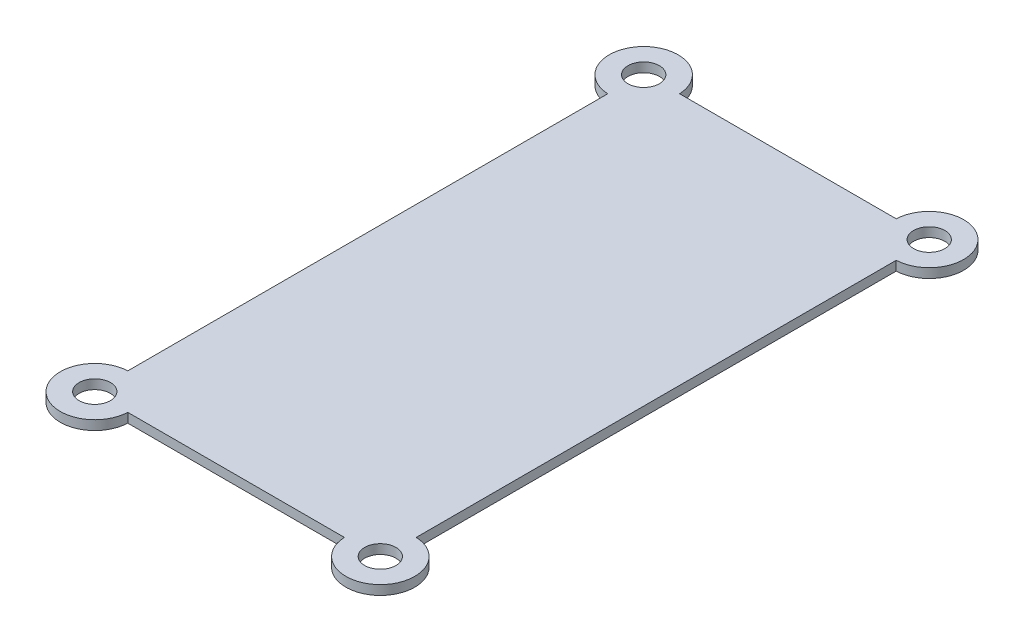
ISO-10303-21;
HEADER;
FILE_DESCRIPTION(('STEP AP214'),'2;1');
FILE_NAME('part.step','',(''),(''),'','','');
FILE_SCHEMA(('AUTOMOTIVE_DESIGN { 1 0 10303 214 1 1 1 1 }'));
ENDSEC;
DATA;
#1=APPLICATION_CONTEXT('core data for automotive mechanical design processes');
#2=APPLICATION_PROTOCOL_DEFINITION('international standard','automotive_design',2000,#1);
#3=PRODUCT_CONTEXT('',#1,'mechanical');
#4=PRODUCT('Part','Part','',(#3));
#5=PRODUCT_RELATED_PRODUCT_CATEGORY('part','',(#4));
#6=PRODUCT_DEFINITION_FORMATION('','',#4);
#7=PRODUCT_DEFINITION_CONTEXT('part definition',#1,'design');
#8=PRODUCT_DEFINITION('design','',#6,#7);
#9=PRODUCT_DEFINITION_SHAPE('','',#8);
#10=(LENGTH_UNIT() NAMED_UNIT(*) SI_UNIT(.MILLI.,.METRE.));
#11=(NAMED_UNIT(*) PLANE_ANGLE_UNIT() SI_UNIT($,.RADIAN.));
#12=(NAMED_UNIT(*) SI_UNIT($,.STERADIAN.) SOLID_ANGLE_UNIT());
#13=UNCERTAINTY_MEASURE_WITH_UNIT(LENGTH_MEASURE(1.E-05),#10,'distance_accuracy_value','');
#14=(GEOMETRIC_REPRESENTATION_CONTEXT(3) GLOBAL_UNCERTAINTY_ASSIGNED_CONTEXT((#13)) GLOBAL_UNIT_ASSIGNED_CONTEXT((#10,
#11,#12)) REPRESENTATION_CONTEXT('',''));
#15=CARTESIAN_POINT('',(0.,0.,0.));
#16=DIRECTION('',(0.,0.,1.));
#17=DIRECTION('',(1.,0.,0.));
#18=AXIS2_PLACEMENT_3D('',#15,#16,#17);
#19=CARTESIAN_POINT('',(28.9150640302673,1.905,42.8850640302673));
#20=DIRECTION('',(0.,-1.,0.));
#21=DIRECTION('',(0.,0.,-1.));
#22=AXIS2_PLACEMENT_3D('',#19,#20,#21);
#23=CYLINDRICAL_SURFACE('',#22,6.985);
#24=CARTESIAN_POINT('',(28.9150640302673,0.,42.8850640302673));
#25=DIRECTION('',(0.,1.,0.));
#26=DIRECTION('',(0.,0.,1.));
#27=AXIS2_PLACEMENT_3D('',#24,#25,#26);
#28=CIRCLE('',#27,6.985);
#29=CARTESIAN_POINT('',(21.9362935243861,0.,43.18));
#30=VERTEX_POINT('',#29);
#31=CARTESIAN_POINT('',(29.21,0.,35.9062935243861));
#32=VERTEX_POINT('',#31);
#33=EDGE_CURVE('E143',#30,#32,#28,.T.);
#34=ORIENTED_EDGE('',*,*,#33,.T.);
#35=DIRECTION('',(0.,-1.,0.));
#36=VECTOR('',#35,1.);
#37=CARTESIAN_POINT('',(29.21,1.905,35.9062935243861));
#38=LINE('',#37,#36);
#39=CARTESIAN_POINT('',(29.21,1.905,35.9062935243861));
#40=VERTEX_POINT('',#39);
#41=EDGE_CURVE('E11',#40,#32,#38,.T.);
#42=ORIENTED_EDGE('',*,*,#41,.F.);
#43=CARTESIAN_POINT('',(28.9150640302673,1.905,42.8850640302673));
#44=DIRECTION('',(0.,1.,0.));
#45=DIRECTION('',(0.,0.,1.));
#46=AXIS2_PLACEMENT_3D('',#43,#44,#45);
#47=CIRCLE('',#46,6.985);
#48=CARTESIAN_POINT('',(21.9362935243861,1.905,43.18));
#49=VERTEX_POINT('',#48);
#50=EDGE_CURVE('E173',#49,#40,#47,.T.);
#51=ORIENTED_EDGE('',*,*,#50,.F.);
#52=DIRECTION('',(0.,-1.,0.));
#53=VECTOR('',#52,1.);
#54=CARTESIAN_POINT('',(21.9362935243861,1.905,43.18));
#55=LINE('',#54,#53);
#56=EDGE_CURVE('E142',#49,#30,#55,.T.);
#57=ORIENTED_EDGE('',*,*,#56,.T.);
#58=EDGE_LOOP('',(#34,#42,#51,#57));
#59=FACE_BOUND('',#58,.T.);
#60=ADVANCED_FACE('F35',(#59),#23,.T.);
#61=CARTESIAN_POINT('',(29.21,1.905,0.));
#62=DIRECTION('',(-1.,0.,0.));
#63=DIRECTION('',(0.,0.,1.));
#64=AXIS2_PLACEMENT_3D('',#61,#62,#63);
#65=PLANE('',#64);
#66=DIRECTION('',(0.,0.,-1.));
#67=VECTOR('',#66,1.);
#68=CARTESIAN_POINT('',(29.21,0.,0.));
#69=LINE('',#68,#67);
#70=CARTESIAN_POINT('',(29.21,0.,-61.306293524386));
#71=VERTEX_POINT('',#70);
#72=EDGE_CURVE('E146',#32,#71,#69,.T.);
#73=ORIENTED_EDGE('',*,*,#72,.T.);
#74=DIRECTION('',(0.,-1.,0.));
#75=VECTOR('',#74,1.);
#76=CARTESIAN_POINT('',(29.21,1.905,-61.306293524386));
#77=LINE('',#76,#75);
#78=CARTESIAN_POINT('',(29.21,1.905,-61.306293524386));
#79=VERTEX_POINT('',#78);
#80=EDGE_CURVE('E43',#79,#71,#77,.T.);
#81=ORIENTED_EDGE('',*,*,#80,.F.);
#82=DIRECTION('',(0.,0.,-1.));
#83=VECTOR('',#82,1.);
#84=CARTESIAN_POINT('',(29.21,1.905,0.));
#85=LINE('',#84,#83);
#86=EDGE_CURVE('E90',#40,#79,#85,.T.);
#87=ORIENTED_EDGE('',*,*,#86,.F.);
#88=ORIENTED_EDGE('',*,*,#41,.T.);
#89=EDGE_LOOP('',(#73,#81,#87,#88));
#90=FACE_BOUND('',#89,.T.);
#91=ADVANCED_FACE('F204',(#90),#65,.F.);
#92=CARTESIAN_POINT('',(28.9150640302673,1.905,-68.2850640302673));
#93=DIRECTION('',(0.,-1.,0.));
#94=DIRECTION('',(0.,0.,-1.));
#95=AXIS2_PLACEMENT_3D('',#92,#93,#94);
#96=CYLINDRICAL_SURFACE('',#95,6.98499999999998);
#97=CARTESIAN_POINT('',(28.9150640302673,0.,-68.2850640302673));
#98=DIRECTION('',(0.,1.,0.));
#99=DIRECTION('',(0.,0.,1.));
#100=AXIS2_PLACEMENT_3D('',#97,#98,#99);
#101=CIRCLE('',#100,6.98499999999998);
#102=CARTESIAN_POINT('',(21.9362935243861,0.,-68.58));
#103=VERTEX_POINT('',#102);
#104=EDGE_CURVE('E148',#71,#103,#101,.T.);
#105=ORIENTED_EDGE('',*,*,#104,.T.);
#106=DIRECTION('',(0.,-1.,0.));
#107=VECTOR('',#106,1.);
#108=CARTESIAN_POINT('',(21.9362935243861,1.905,-68.58));
#109=LINE('',#108,#107);
#110=CARTESIAN_POINT('',(21.9362935243861,1.905,-68.58));
#111=VERTEX_POINT('',#110);
#112=EDGE_CURVE('E179',#111,#103,#109,.T.);
#113=ORIENTED_EDGE('',*,*,#112,.F.);
#114=CARTESIAN_POINT('',(28.9150640302673,1.905,-68.2850640302673));
#115=DIRECTION('',(0.,1.,0.));
#116=DIRECTION('',(0.,0.,1.));
#117=AXIS2_PLACEMENT_3D('',#114,#115,#116);
#118=CIRCLE('',#117,6.98499999999998);
#119=EDGE_CURVE('E186',#79,#111,#118,.T.);
#120=ORIENTED_EDGE('',*,*,#119,.F.);
#121=ORIENTED_EDGE('',*,*,#80,.T.);
#122=EDGE_LOOP('',(#105,#113,#120,#121));
#123=FACE_BOUND('',#122,.T.);
#124=ADVANCED_FACE('F184',(#123),#96,.T.);
#125=CARTESIAN_POINT('',(0.,1.905,-68.58));
#126=DIRECTION('',(0.,0.,-1.));
#127=DIRECTION('',(-1.,0.,0.));
#128=AXIS2_PLACEMENT_3D('',#125,#126,#127);
#129=PLANE('',#128);
#130=DIRECTION('',(1.,0.,0.));
#131=VECTOR('',#130,1.);
#132=CARTESIAN_POINT('',(0.,0.,-68.58));
#133=LINE('',#132,#131);
#134=CARTESIAN_POINT('',(-21.9362935243861,0.,-68.58));
#135=VERTEX_POINT('',#134);
#136=EDGE_CURVE('E151',#135,#103,#133,.T.);
#137=ORIENTED_EDGE('',*,*,#136,.F.);
#138=DIRECTION('',(0.,-1.,0.));
#139=VECTOR('',#138,1.);
#140=CARTESIAN_POINT('',(-21.9362935243861,1.905,-68.58));
#141=LINE('',#140,#139);
#142=CARTESIAN_POINT('',(-21.9362935243861,1.905,-68.58));
#143=VERTEX_POINT('',#142);
#144=EDGE_CURVE('E177',#143,#135,#141,.T.);
#145=ORIENTED_EDGE('',*,*,#144,.F.);
#146=DIRECTION('',(1.,0.,0.));
#147=VECTOR('',#146,1.);
#148=CARTESIAN_POINT('',(0.,1.905,-68.58));
#149=LINE('',#148,#147);
#150=EDGE_CURVE('E196',#143,#111,#149,.T.);
#151=ORIENTED_EDGE('',*,*,#150,.T.);
#152=ORIENTED_EDGE('',*,*,#112,.T.);
#153=EDGE_LOOP('',(#137,#145,#151,#152));
#154=FACE_BOUND('',#153,.T.);
#155=ADVANCED_FACE('F194',(#154),#129,.T.);
#156=CARTESIAN_POINT('',(-28.9150640302673,1.905,-68.2850640302673));
#157=DIRECTION('',(0.,-1.,0.));
#158=DIRECTION('',(0.,0.,-1.));
#159=AXIS2_PLACEMENT_3D('',#156,#157,#158);
#160=CYLINDRICAL_SURFACE('',#159,6.985);
#161=CARTESIAN_POINT('',(-28.9150640302673,0.,-68.2850640302673));
#162=DIRECTION('',(0.,1.,0.));
#163=DIRECTION('',(0.,0.,1.));
#164=AXIS2_PLACEMENT_3D('',#161,#162,#163);
#165=CIRCLE('',#164,6.985);
#166=CARTESIAN_POINT('',(-29.21,0.,-61.306293524386));
#167=VERTEX_POINT('',#166);
#168=EDGE_CURVE('E154',#167,#135,#165,.F.);
#169=ORIENTED_EDGE('',*,*,#168,.F.);
#170=DIRECTION('',(0.,-1.,0.));
#171=VECTOR('',#170,1.);
#172=CARTESIAN_POINT('',(-29.21,1.905,-61.306293524386));
#173=LINE('',#172,#171);
#174=CARTESIAN_POINT('',(-29.21,1.905,-61.306293524386));
#175=VERTEX_POINT('',#174);
#176=EDGE_CURVE('E123',#175,#167,#173,.T.);
#177=ORIENTED_EDGE('',*,*,#176,.F.);
#178=CARTESIAN_POINT('',(-28.9150640302673,1.905,-68.2850640302673));
#179=DIRECTION('',(0.,1.,0.));
#180=DIRECTION('',(0.,0.,1.));
#181=AXIS2_PLACEMENT_3D('',#178,#179,#180);
#182=CIRCLE('',#181,6.985);
#183=EDGE_CURVE('E112',#175,#143,#182,.F.);
#184=ORIENTED_EDGE('',*,*,#183,.T.);
#185=ORIENTED_EDGE('',*,*,#144,.T.);
#186=EDGE_LOOP('',(#169,#177,#184,#185));
#187=FACE_BOUND('',#186,.T.);
#188=ADVANCED_FACE('F214',(#187),#160,.T.);
#189=CARTESIAN_POINT('',(-29.21,1.905,0.));
#190=DIRECTION('',(1.,0.,0.));
#191=DIRECTION('',(0.,0.,-1.));
#192=AXIS2_PLACEMENT_3D('',#189,#190,#191);
#193=PLANE('',#192);
#194=DIRECTION('',(0.,0.,1.));
#195=VECTOR('',#194,1.);
#196=CARTESIAN_POINT('',(-29.21,0.,0.));
#197=LINE('',#196,#195);
#198=CARTESIAN_POINT('',(-29.21,0.,35.9062935243861));
#199=VERTEX_POINT('',#198);
#200=EDGE_CURVE('E119',#167,#199,#197,.T.);
#201=ORIENTED_EDGE('',*,*,#200,.T.);
#202=DIRECTION('',(0.,-1.,0.));
#203=VECTOR('',#202,1.);
#204=CARTESIAN_POINT('',(-29.21,1.905,35.9062935243861));
#205=LINE('',#204,#203);
#206=CARTESIAN_POINT('',(-29.21,1.905,35.9062935243861));
#207=VERTEX_POINT('',#206);
#208=EDGE_CURVE('E116',#207,#199,#205,.T.);
#209=ORIENTED_EDGE('',*,*,#208,.F.);
#210=DIRECTION('',(0.,0.,1.));
#211=VECTOR('',#210,1.);
#212=CARTESIAN_POINT('',(-29.21,1.905,0.));
#213=LINE('',#212,#211);
#214=EDGE_CURVE('E104',#175,#207,#213,.T.);
#215=ORIENTED_EDGE('',*,*,#214,.F.);
#216=ORIENTED_EDGE('',*,*,#176,.T.);
#217=EDGE_LOOP('',(#201,#209,#215,#216));
#218=FACE_BOUND('',#217,.T.);
#219=ADVANCED_FACE('F117',(#218),#193,.F.);
#220=CARTESIAN_POINT('',(-28.9150640302673,1.905,42.8850640302673));
#221=DIRECTION('',(0.,-1.,0.));
#222=DIRECTION('',(0.,0.,-1.));
#223=AXIS2_PLACEMENT_3D('',#220,#221,#222);
#224=CYLINDRICAL_SURFACE('',#223,6.985);
#225=CARTESIAN_POINT('',(-28.9150640302673,0.,42.8850640302673));
#226=DIRECTION('',(0.,1.,0.));
#227=DIRECTION('',(0.,0.,1.));
#228=AXIS2_PLACEMENT_3D('',#225,#226,#227);
#229=CIRCLE('',#228,6.985);
#230=CARTESIAN_POINT('',(-21.9362935243861,0.,43.18));
#231=VERTEX_POINT('',#230);
#232=EDGE_CURVE('E158',#231,#199,#229,.F.);
#233=ORIENTED_EDGE('',*,*,#232,.F.);
#234=DIRECTION('',(0.,-1.,0.));
#235=VECTOR('',#234,1.);
#236=CARTESIAN_POINT('',(-21.9362935243861,1.905,43.18));
#237=LINE('',#236,#235);
#238=CARTESIAN_POINT('',(-21.9362935243861,1.905,43.18));
#239=VERTEX_POINT('',#238);
#240=EDGE_CURVE('E79',#239,#231,#237,.T.);
#241=ORIENTED_EDGE('',*,*,#240,.F.);
#242=CARTESIAN_POINT('',(-28.9150640302673,1.905,42.8850640302673));
#243=DIRECTION('',(0.,1.,0.));
#244=DIRECTION('',(0.,0.,1.));
#245=AXIS2_PLACEMENT_3D('',#242,#243,#244);
#246=CIRCLE('',#245,6.985);
#247=EDGE_CURVE('E109',#239,#207,#246,.F.);
#248=ORIENTED_EDGE('',*,*,#247,.T.);
#249=ORIENTED_EDGE('',*,*,#208,.T.);
#250=EDGE_LOOP('',(#233,#241,#248,#249));
#251=FACE_BOUND('',#250,.T.);
#252=ADVANCED_FACE('F125',(#251),#224,.T.);
#253=CARTESIAN_POINT('',(28.9150640302673,1.905,-68.2850640302673));
#254=DIRECTION('',(0.,-1.,0.));
#255=DIRECTION('',(0.,0.,-1.));
#256=AXIS2_PLACEMENT_3D('',#253,#254,#255);
#257=CYLINDRICAL_SURFACE('',#256,3.175);
#258=CARTESIAN_POINT('',(28.9150640302673,1.905,-68.2850640302673));
#259=DIRECTION('',(0.,1.,0.));
#260=DIRECTION('',(0.,0.,1.));
#261=AXIS2_PLACEMENT_3D('',#258,#259,#260);
#262=CIRCLE('',#261,3.175);
#263=CARTESIAN_POINT('',(28.9150640302673,1.905,-71.4600640302673));
#264=VERTEX_POINT('',#263);
#265=EDGE_CURVE('E136',#264,#264,#262,.T.);
#266=CARTESIAN_POINT('',(28.9150640302673,0.,-68.2850640302673));
#267=DIRECTION('',(0.,1.,0.));
#268=DIRECTION('',(0.,0.,1.));
#269=AXIS2_PLACEMENT_3D('',#266,#267,#268);
#270=CIRCLE('',#269,3.175);
#271=CARTESIAN_POINT('',(28.9150640302673,0.,-71.4600640302673));
#272=VERTEX_POINT('',#271);
#273=EDGE_CURVE('E167',#272,#272,#270,.T.);
#274=CARTESIAN_POINT('',(28.9150640302673,1.905,-71.4600640302673));
#275=CARTESIAN_POINT('',(28.9150640302673,1.88515625,-71.4600640302673));
#276=CARTESIAN_POINT('',(28.9150640302673,1.8653125,-71.4600640302673));
#277=CARTESIAN_POINT('',(28.9150640302673,1.825625,-71.4600640302673));
#278=CARTESIAN_POINT('',(28.9150640302673,1.80578125,-71.4600640302673));
#279=CARTESIAN_POINT('',(28.9150640302673,1.76609375,-71.4600640302673));
#280=CARTESIAN_POINT('',(28.9150640302673,1.74625,-71.4600640302673));
#281=CARTESIAN_POINT('',(28.9150640302673,1.7065625,-71.4600640302673));
#282=CARTESIAN_POINT('',(28.9150640302673,1.68671875,-71.4600640302673));
#283=CARTESIAN_POINT('',(28.9150640302673,1.64703125,-71.4600640302673));
#284=CARTESIAN_POINT('',(28.9150640302673,1.6271875,-71.4600640302673));
#285=CARTESIAN_POINT('',(28.9150640302673,1.5875,-71.4600640302673));
#286=CARTESIAN_POINT('',(28.9150640302673,1.56765625,-71.4600640302673));
#287=CARTESIAN_POINT('',(28.9150640302673,1.52796875,-71.4600640302673));
#288=CARTESIAN_POINT('',(28.9150640302673,1.508125,-71.4600640302673));
#289=CARTESIAN_POINT('',(28.9150640302673,1.4684375,-71.4600640302673));
#290=CARTESIAN_POINT('',(28.9150640302673,1.44859375,-71.4600640302673));
#291=CARTESIAN_POINT('',(28.9150640302673,1.40890625,-71.4600640302673));
#292=CARTESIAN_POINT('',(28.9150640302673,1.3890625,-71.4600640302673));
#293=CARTESIAN_POINT('',(28.9150640302673,1.349375,-71.4600640302673));
#294=CARTESIAN_POINT('',(28.9150640302673,1.32953125,-71.4600640302673));
#295=CARTESIAN_POINT('',(28.9150640302673,1.28984375,-71.4600640302673));
#296=CARTESIAN_POINT('',(28.9150640302673,1.27,-71.4600640302673));
#297=CARTESIAN_POINT('',(28.9150640302673,1.2303125,-71.4600640302673));
#298=CARTESIAN_POINT('',(28.9150640302673,1.21046875,-71.4600640302673));
#299=CARTESIAN_POINT('',(28.9150640302673,1.17078125,-71.4600640302673));
#300=CARTESIAN_POINT('',(28.9150640302673,1.1509375,-71.4600640302673));
#301=CARTESIAN_POINT('',(28.9150640302673,1.11125,-71.4600640302673));
#302=CARTESIAN_POINT('',(28.9150640302673,1.09140625,-71.4600640302673));
#303=CARTESIAN_POINT('',(28.9150640302673,1.05171875,-71.4600640302673));
#304=CARTESIAN_POINT('',(28.9150640302673,1.031875,-71.4600640302673));
#305=CARTESIAN_POINT('',(28.9150640302673,0.9921875,-71.4600640302673));
#306=CARTESIAN_POINT('',(28.9150640302673,0.97234375,-71.4600640302673));
#307=CARTESIAN_POINT('',(28.9150640302673,0.93265625,-71.4600640302673));
#308=CARTESIAN_POINT('',(28.9150640302673,0.9128125,-71.4600640302673));
#309=CARTESIAN_POINT('',(28.9150640302673,0.873125,-71.4600640302673));
#310=CARTESIAN_POINT('',(28.9150640302673,0.85328125,-71.4600640302673));
#311=CARTESIAN_POINT('',(28.9150640302673,0.81359375,-71.4600640302673));
#312=CARTESIAN_POINT('',(28.9150640302673,0.79375,-71.4600640302673));
#313=CARTESIAN_POINT('',(28.9150640302673,0.7540625,-71.4600640302673));
#314=CARTESIAN_POINT('',(28.9150640302673,0.73421875,-71.4600640302673));
#315=CARTESIAN_POINT('',(28.9150640302673,0.69453125,-71.4600640302673));
#316=CARTESIAN_POINT('',(28.9150640302673,0.6746875,-71.4600640302673));
#317=CARTESIAN_POINT('',(28.9150640302673,0.635,-71.4600640302673));
#318=CARTESIAN_POINT('',(28.9150640302673,0.61515625,-71.4600640302673));
#319=CARTESIAN_POINT('',(28.9150640302673,0.57546875,-71.4600640302673));
#320=CARTESIAN_POINT('',(28.9150640302673,0.555625,-71.4600640302673));
#321=CARTESIAN_POINT('',(28.9150640302673,0.5159375,-71.4600640302673));
#322=CARTESIAN_POINT('',(28.9150640302673,0.49609375,-71.4600640302673));
#323=CARTESIAN_POINT('',(28.9150640302673,0.45640625,-71.4600640302673));
#324=CARTESIAN_POINT('',(28.9150640302673,0.4365625,-71.4600640302673));
#325=CARTESIAN_POINT('',(28.9150640302673,0.396875,-71.4600640302673));
#326=CARTESIAN_POINT('',(28.9150640302673,0.37703125,-71.4600640302673));
#327=CARTESIAN_POINT('',(28.9150640302673,0.33734375,-71.4600640302673));
#328=CARTESIAN_POINT('',(28.9150640302673,0.3175,-71.4600640302673));
#329=CARTESIAN_POINT('',(28.9150640302673,0.2778125,-71.4600640302673));
#330=CARTESIAN_POINT('',(28.9150640302673,0.25796875,-71.4600640302673));
#331=CARTESIAN_POINT('',(28.9150640302673,0.21828125,-71.4600640302673));
#332=CARTESIAN_POINT('',(28.9150640302673,0.1984375,-71.4600640302673));
#333=CARTESIAN_POINT('',(28.9150640302673,0.15875,-71.4600640302673));
#334=CARTESIAN_POINT('',(28.9150640302673,0.13890625,-71.4600640302673));
#335=CARTESIAN_POINT('',(28.9150640302673,0.09921875,-71.4600640302673));
#336=CARTESIAN_POINT('',(28.9150640302673,0.0793749999999999,-71.4600640302673));
#337=CARTESIAN_POINT('',(28.9150640302673,0.0396874999999999,-71.4600640302673));
#338=CARTESIAN_POINT('',(28.9150640302673,0.01984375,-71.4600640302673));
#339=CARTESIAN_POINT('',(28.9150640302673,0.,-71.4600640302673));
#340=B_SPLINE_CURVE_WITH_KNOTS('',3,(#274,#275,#276,#277,#278,#279,#280,#281,#282,#283,#284,
#285,#286,#287,#288,#289,#290,#291,#292,#293,#294,#295,#296,#297,#298,#299,#300,#301,#302,#303,
#304,#305,#306,#307,#308,#309,#310,#311,#312,#313,#314,#315,#316,#317,#318,#319,#320,#321,#322,
#323,#324,#325,#326,#327,#328,#329,#330,#331,#332,#333,#334,#335,#336,#337,#338,#339),
.UNSPECIFIED.,.F.,.F.,(4,2,2,2,2,2,2,2,2,2,2,2,2,2,2,2,2,2,2,2,2,2,2,2,2,2,2,2,2,2,2,2,4),(0.,
0.0595312500000001,0.1190625,0.17859375,0.238125,0.29765625,0.3571875,0.41671875,0.47625,
0.53578125,0.5953125,0.65484375,0.714375,0.77390625,0.8334375,0.89296875,0.9525,1.01203125,
1.0715625,1.13109375,1.190625,1.25015625,1.3096875,1.36921875,1.42875,1.48828125,1.5478125,
1.60734375,1.666875,1.72640625,1.7859375,1.84546875,1.905),.UNSPECIFIED.);
#341=EDGE_CURVE('BSEAM222',#264,#272,#340,.T.);
#342=ORIENTED_EDGE('',*,*,#265,.T.);
#343=ORIENTED_EDGE('',*,*,#273,.F.);
#344=ORIENTED_EDGE('',*,*,#341,.T.);
#345=ORIENTED_EDGE('',*,*,#341,.F.);
#346=EDGE_LOOP('',(#342,#344,#343,#345));
#347=FACE_BOUND('',#346,.T.);
#348=ADVANCED_FACE('F222',(#347),#257,.F.);
#349=CARTESIAN_POINT('',(28.9150640302673,1.905,42.8850640302673));
#350=DIRECTION('',(0.,-1.,0.));
#351=DIRECTION('',(0.,0.,-1.));
#352=AXIS2_PLACEMENT_3D('',#349,#350,#351);
#353=CYLINDRICAL_SURFACE('',#352,3.175);
#354=CARTESIAN_POINT('',(28.9150640302673,1.905,42.8850640302673));
#355=DIRECTION('',(0.,1.,0.));
#356=DIRECTION('',(0.,0.,1.));
#357=AXIS2_PLACEMENT_3D('',#354,#355,#356);
#358=CIRCLE('',#357,3.175);
#359=CARTESIAN_POINT('',(28.9150640302673,1.905,39.7100640302673));
#360=VERTEX_POINT('',#359);
#361=EDGE_CURVE('E133',#360,#360,#358,.T.);
#362=CARTESIAN_POINT('',(28.9150640302673,0.,42.8850640302673));
#363=DIRECTION('',(0.,1.,0.));
#364=DIRECTION('',(0.,0.,1.));
#365=AXIS2_PLACEMENT_3D('',#362,#363,#364);
#366=CIRCLE('',#365,3.175);
#367=CARTESIAN_POINT('',(28.9150640302673,0.,39.7100640302673));
#368=VERTEX_POINT('',#367);
#369=EDGE_CURVE('E164',#368,#368,#366,.T.);
#370=CARTESIAN_POINT('',(28.9150640302673,1.905,39.7100640302673));
#371=CARTESIAN_POINT('',(28.9150640302673,1.88515625,39.7100640302673));
#372=CARTESIAN_POINT('',(28.9150640302673,1.8653125,39.7100640302673));
#373=CARTESIAN_POINT('',(28.9150640302673,1.825625,39.7100640302673));
#374=CARTESIAN_POINT('',(28.9150640302673,1.80578125,39.7100640302673));
#375=CARTESIAN_POINT('',(28.9150640302673,1.76609375,39.7100640302673));
#376=CARTESIAN_POINT('',(28.9150640302673,1.74625,39.7100640302673));
#377=CARTESIAN_POINT('',(28.9150640302673,1.7065625,39.7100640302673));
#378=CARTESIAN_POINT('',(28.9150640302673,1.68671875,39.7100640302673));
#379=CARTESIAN_POINT('',(28.9150640302673,1.64703125,39.7100640302673));
#380=CARTESIAN_POINT('',(28.9150640302673,1.6271875,39.7100640302673));
#381=CARTESIAN_POINT('',(28.9150640302673,1.5875,39.7100640302673));
#382=CARTESIAN_POINT('',(28.9150640302673,1.56765625,39.7100640302673));
#383=CARTESIAN_POINT('',(28.9150640302673,1.52796875,39.7100640302673));
#384=CARTESIAN_POINT('',(28.9150640302673,1.508125,39.7100640302673));
#385=CARTESIAN_POINT('',(28.9150640302673,1.4684375,39.7100640302673));
#386=CARTESIAN_POINT('',(28.9150640302673,1.44859375,39.7100640302673));
#387=CARTESIAN_POINT('',(28.9150640302673,1.40890625,39.7100640302673));
#388=CARTESIAN_POINT('',(28.9150640302673,1.3890625,39.7100640302673));
#389=CARTESIAN_POINT('',(28.9150640302673,1.349375,39.7100640302673));
#390=CARTESIAN_POINT('',(28.9150640302673,1.32953125,39.7100640302673));
#391=CARTESIAN_POINT('',(28.9150640302673,1.28984375,39.7100640302673));
#392=CARTESIAN_POINT('',(28.9150640302673,1.27,39.7100640302673));
#393=CARTESIAN_POINT('',(28.9150640302673,1.2303125,39.7100640302673));
#394=CARTESIAN_POINT('',(28.9150640302673,1.21046875,39.7100640302673));
#395=CARTESIAN_POINT('',(28.9150640302673,1.17078125,39.7100640302673));
#396=CARTESIAN_POINT('',(28.9150640302673,1.1509375,39.7100640302673));
#397=CARTESIAN_POINT('',(28.9150640302673,1.11125,39.7100640302673));
#398=CARTESIAN_POINT('',(28.9150640302673,1.09140625,39.7100640302673));
#399=CARTESIAN_POINT('',(28.9150640302673,1.05171875,39.7100640302673));
#400=CARTESIAN_POINT('',(28.9150640302673,1.031875,39.7100640302673));
#401=CARTESIAN_POINT('',(28.9150640302673,0.9921875,39.7100640302673));
#402=CARTESIAN_POINT('',(28.9150640302673,0.97234375,39.7100640302673));
#403=CARTESIAN_POINT('',(28.9150640302673,0.93265625,39.7100640302673));
#404=CARTESIAN_POINT('',(28.9150640302673,0.9128125,39.7100640302673));
#405=CARTESIAN_POINT('',(28.9150640302673,0.873125,39.7100640302673));
#406=CARTESIAN_POINT('',(28.9150640302673,0.85328125,39.7100640302673));
#407=CARTESIAN_POINT('',(28.9150640302673,0.81359375,39.7100640302673));
#408=CARTESIAN_POINT('',(28.9150640302673,0.79375,39.7100640302673));
#409=CARTESIAN_POINT('',(28.9150640302673,0.7540625,39.7100640302673));
#410=CARTESIAN_POINT('',(28.9150640302673,0.73421875,39.7100640302673));
#411=CARTESIAN_POINT('',(28.9150640302673,0.69453125,39.7100640302673));
#412=CARTESIAN_POINT('',(28.9150640302673,0.6746875,39.7100640302673));
#413=CARTESIAN_POINT('',(28.9150640302673,0.635,39.7100640302673));
#414=CARTESIAN_POINT('',(28.9150640302673,0.61515625,39.7100640302673));
#415=CARTESIAN_POINT('',(28.9150640302673,0.57546875,39.7100640302673));
#416=CARTESIAN_POINT('',(28.9150640302673,0.555625,39.7100640302673));
#417=CARTESIAN_POINT('',(28.9150640302673,0.5159375,39.7100640302673));
#418=CARTESIAN_POINT('',(28.9150640302673,0.49609375,39.7100640302673));
#419=CARTESIAN_POINT('',(28.9150640302673,0.45640625,39.7100640302673));
#420=CARTESIAN_POINT('',(28.9150640302673,0.4365625,39.7100640302673));
#421=CARTESIAN_POINT('',(28.9150640302673,0.396875,39.7100640302673));
#422=CARTESIAN_POINT('',(28.9150640302673,0.37703125,39.7100640302673));
#423=CARTESIAN_POINT('',(28.9150640302673,0.33734375,39.7100640302673));
#424=CARTESIAN_POINT('',(28.9150640302673,0.3175,39.7100640302673));
#425=CARTESIAN_POINT('',(28.9150640302673,0.2778125,39.7100640302673));
#426=CARTESIAN_POINT('',(28.9150640302673,0.25796875,39.7100640302673));
#427=CARTESIAN_POINT('',(28.9150640302673,0.21828125,39.7100640302673));
#428=CARTESIAN_POINT('',(28.9150640302673,0.1984375,39.7100640302673));
#429=CARTESIAN_POINT('',(28.9150640302673,0.15875,39.7100640302673));
#430=CARTESIAN_POINT('',(28.9150640302673,0.13890625,39.7100640302673));
#431=CARTESIAN_POINT('',(28.9150640302673,0.09921875,39.7100640302673));
#432=CARTESIAN_POINT('',(28.9150640302673,0.0793749999999999,39.7100640302673));
#433=CARTESIAN_POINT('',(28.9150640302673,0.0396874999999999,39.7100640302673));
#434=CARTESIAN_POINT('',(28.9150640302673,0.01984375,39.7100640302673));
#435=CARTESIAN_POINT('',(28.9150640302673,0.,39.7100640302673));
#436=B_SPLINE_CURVE_WITH_KNOTS('',3,(#370,#371,#372,#373,#374,#375,#376,#377,#378,#379,#380,
#381,#382,#383,#384,#385,#386,#387,#388,#389,#390,#391,#392,#393,#394,#395,#396,#397,#398,#399,
#400,#401,#402,#403,#404,#405,#406,#407,#408,#409,#410,#411,#412,#413,#414,#415,#416,#417,#418,
#419,#420,#421,#422,#423,#424,#425,#426,#427,#428,#429,#430,#431,#432,#433,#434,#435),
.UNSPECIFIED.,.F.,.F.,(4,2,2,2,2,2,2,2,2,2,2,2,2,2,2,2,2,2,2,2,2,2,2,2,2,2,2,2,2,2,2,2,4),(0.,
0.0595312500000001,0.1190625,0.17859375,0.238125,0.29765625,0.3571875,0.41671875,0.47625,
0.53578125,0.5953125,0.65484375,0.714375,0.77390625,0.8334375,0.89296875,0.9525,1.01203125,
1.0715625,1.13109375,1.190625,1.25015625,1.3096875,1.36921875,1.42875,1.48828125,1.5478125,
1.60734375,1.666875,1.72640625,1.7859375,1.84546875,1.905),.UNSPECIFIED.);
#437=EDGE_CURVE('BSEAM230',#360,#368,#436,.T.);
#438=ORIENTED_EDGE('',*,*,#361,.T.);
#439=ORIENTED_EDGE('',*,*,#369,.F.);
#440=ORIENTED_EDGE('',*,*,#437,.T.);
#441=ORIENTED_EDGE('',*,*,#437,.F.);
#442=EDGE_LOOP('',(#438,#440,#439,#441));
#443=FACE_BOUND('',#442,.T.);
#444=ADVANCED_FACE('F230',(#443),#353,.F.);
#445=CARTESIAN_POINT('',(-28.9150640302673,1.905,42.8850640302673));
#446=DIRECTION('',(0.,-1.,0.));
#447=DIRECTION('',(0.,0.,-1.));
#448=AXIS2_PLACEMENT_3D('',#445,#446,#447);
#449=CYLINDRICAL_SURFACE('',#448,3.175);
#450=CARTESIAN_POINT('',(-28.9150640302673,1.905,42.8850640302673));
#451=DIRECTION('',(0.,1.,0.));
#452=DIRECTION('',(0.,0.,1.));
#453=AXIS2_PLACEMENT_3D('',#450,#451,#452);
#454=CIRCLE('',#453,3.175);
#455=CARTESIAN_POINT('',(-28.9150640302673,1.905,39.7100640302673));
#456=VERTEX_POINT('',#455);
#457=EDGE_CURVE('E127',#456,#456,#454,.F.);
#458=CARTESIAN_POINT('',(-28.9150640302673,0.,42.8850640302673));
#459=DIRECTION('',(0.,1.,0.));
#460=DIRECTION('',(0.,0.,1.));
#461=AXIS2_PLACEMENT_3D('',#458,#459,#460);
#462=CIRCLE('',#461,3.175);
#463=CARTESIAN_POINT('',(-28.9150640302673,0.,39.7100640302673));
#464=VERTEX_POINT('',#463);
#465=EDGE_CURVE('E161',#464,#464,#462,.F.);
#466=CARTESIAN_POINT('',(-28.9150640302673,1.905,39.7100640302673));
#467=CARTESIAN_POINT('',(-28.9150640302673,1.88515625,39.7100640302673));
#468=CARTESIAN_POINT('',(-28.9150640302673,1.8653125,39.7100640302673));
#469=CARTESIAN_POINT('',(-28.9150640302673,1.825625,39.7100640302673));
#470=CARTESIAN_POINT('',(-28.9150640302673,1.80578125,39.7100640302673));
#471=CARTESIAN_POINT('',(-28.9150640302673,1.76609375,39.7100640302673));
#472=CARTESIAN_POINT('',(-28.9150640302673,1.74625,39.7100640302673));
#473=CARTESIAN_POINT('',(-28.9150640302673,1.7065625,39.7100640302673));
#474=CARTESIAN_POINT('',(-28.9150640302673,1.68671875,39.7100640302673));
#475=CARTESIAN_POINT('',(-28.9150640302673,1.64703125,39.7100640302673));
#476=CARTESIAN_POINT('',(-28.9150640302673,1.6271875,39.7100640302673));
#477=CARTESIAN_POINT('',(-28.9150640302673,1.5875,39.7100640302673));
#478=CARTESIAN_POINT('',(-28.9150640302673,1.56765625,39.7100640302673));
#479=CARTESIAN_POINT('',(-28.9150640302673,1.52796875,39.7100640302673));
#480=CARTESIAN_POINT('',(-28.9150640302673,1.508125,39.7100640302673));
#481=CARTESIAN_POINT('',(-28.9150640302673,1.4684375,39.7100640302673));
#482=CARTESIAN_POINT('',(-28.9150640302673,1.44859375,39.7100640302673));
#483=CARTESIAN_POINT('',(-28.9150640302673,1.40890625,39.7100640302673));
#484=CARTESIAN_POINT('',(-28.9150640302673,1.3890625,39.7100640302673));
#485=CARTESIAN_POINT('',(-28.9150640302673,1.349375,39.7100640302673));
#486=CARTESIAN_POINT('',(-28.9150640302673,1.32953125,39.7100640302673));
#487=CARTESIAN_POINT('',(-28.9150640302673,1.28984375,39.7100640302673));
#488=CARTESIAN_POINT('',(-28.9150640302673,1.27,39.7100640302673));
#489=CARTESIAN_POINT('',(-28.9150640302673,1.2303125,39.7100640302673));
#490=CARTESIAN_POINT('',(-28.9150640302673,1.21046875,39.7100640302673));
#491=CARTESIAN_POINT('',(-28.9150640302673,1.17078125,39.7100640302673));
#492=CARTESIAN_POINT('',(-28.9150640302673,1.1509375,39.7100640302673));
#493=CARTESIAN_POINT('',(-28.9150640302673,1.11125,39.7100640302673));
#494=CARTESIAN_POINT('',(-28.9150640302673,1.09140625,39.7100640302673));
#495=CARTESIAN_POINT('',(-28.9150640302673,1.05171875,39.7100640302673));
#496=CARTESIAN_POINT('',(-28.9150640302673,1.031875,39.7100640302673));
#497=CARTESIAN_POINT('',(-28.9150640302673,0.9921875,39.7100640302673));
#498=CARTESIAN_POINT('',(-28.9150640302673,0.97234375,39.7100640302673));
#499=CARTESIAN_POINT('',(-28.9150640302673,0.93265625,39.7100640302673));
#500=CARTESIAN_POINT('',(-28.9150640302673,0.9128125,39.7100640302673));
#501=CARTESIAN_POINT('',(-28.9150640302673,0.873125,39.7100640302673));
#502=CARTESIAN_POINT('',(-28.9150640302673,0.85328125,39.7100640302673));
#503=CARTESIAN_POINT('',(-28.9150640302673,0.81359375,39.7100640302673));
#504=CARTESIAN_POINT('',(-28.9150640302673,0.79375,39.7100640302673));
#505=CARTESIAN_POINT('',(-28.9150640302673,0.7540625,39.7100640302673));
#506=CARTESIAN_POINT('',(-28.9150640302673,0.73421875,39.7100640302673));
#507=CARTESIAN_POINT('',(-28.9150640302673,0.69453125,39.7100640302673));
#508=CARTESIAN_POINT('',(-28.9150640302673,0.6746875,39.7100640302673));
#509=CARTESIAN_POINT('',(-28.9150640302673,0.635,39.7100640302673));
#510=CARTESIAN_POINT('',(-28.9150640302673,0.61515625,39.7100640302673));
#511=CARTESIAN_POINT('',(-28.9150640302673,0.57546875,39.7100640302673));
#512=CARTESIAN_POINT('',(-28.9150640302673,0.555625,39.7100640302673));
#513=CARTESIAN_POINT('',(-28.9150640302673,0.5159375,39.7100640302673));
#514=CARTESIAN_POINT('',(-28.9150640302673,0.49609375,39.7100640302673));
#515=CARTESIAN_POINT('',(-28.9150640302673,0.45640625,39.7100640302673));
#516=CARTESIAN_POINT('',(-28.9150640302673,0.4365625,39.7100640302673));
#517=CARTESIAN_POINT('',(-28.9150640302673,0.396875,39.7100640302673));
#518=CARTESIAN_POINT('',(-28.9150640302673,0.37703125,39.7100640302673));
#519=CARTESIAN_POINT('',(-28.9150640302673,0.33734375,39.7100640302673));
#520=CARTESIAN_POINT('',(-28.9150640302673,0.3175,39.7100640302673));
#521=CARTESIAN_POINT('',(-28.9150640302673,0.2778125,39.7100640302673));
#522=CARTESIAN_POINT('',(-28.9150640302673,0.25796875,39.7100640302673));
#523=CARTESIAN_POINT('',(-28.9150640302673,0.21828125,39.7100640302673));
#524=CARTESIAN_POINT('',(-28.9150640302673,0.1984375,39.7100640302673));
#525=CARTESIAN_POINT('',(-28.9150640302673,0.15875,39.7100640302673));
#526=CARTESIAN_POINT('',(-28.9150640302673,0.13890625,39.7100640302673));
#527=CARTESIAN_POINT('',(-28.9150640302673,0.09921875,39.7100640302673));
#528=CARTESIAN_POINT('',(-28.9150640302673,0.0793749999999999,39.7100640302673));
#529=CARTESIAN_POINT('',(-28.9150640302673,0.0396874999999999,39.7100640302673));
#530=CARTESIAN_POINT('',(-28.9150640302673,0.01984375,39.7100640302673));
#531=CARTESIAN_POINT('',(-28.9150640302673,0.,39.7100640302673));
#532=B_SPLINE_CURVE_WITH_KNOTS('',3,(#466,#467,#468,#469,#470,#471,#472,#473,#474,#475,#476,
#477,#478,#479,#480,#481,#482,#483,#484,#485,#486,#487,#488,#489,#490,#491,#492,#493,#494,#495,
#496,#497,#498,#499,#500,#501,#502,#503,#504,#505,#506,#507,#508,#509,#510,#511,#512,#513,#514,
#515,#516,#517,#518,#519,#520,#521,#522,#523,#524,#525,#526,#527,#528,#529,#530,#531),
.UNSPECIFIED.,.F.,.F.,(4,2,2,2,2,2,2,2,2,2,2,2,2,2,2,2,2,2,2,2,2,2,2,2,2,2,2,2,2,2,2,2,4),(0.,
0.0595312500000001,0.1190625,0.17859375,0.238125,0.29765625,0.3571875,0.41671875,0.47625,
0.53578125,0.5953125,0.65484375,0.714375,0.77390625,0.8334375,0.89296875,0.9525,1.01203125,
1.0715625,1.13109375,1.190625,1.25015625,1.3096875,1.36921875,1.42875,1.48828125,1.5478125,
1.60734375,1.666875,1.72640625,1.7859375,1.84546875,1.905),.UNSPECIFIED.);
#533=EDGE_CURVE('BSEAM227',#456,#464,#532,.T.);
#534=ORIENTED_EDGE('',*,*,#457,.F.);
#535=ORIENTED_EDGE('',*,*,#465,.T.);
#536=ORIENTED_EDGE('',*,*,#533,.T.);
#537=ORIENTED_EDGE('',*,*,#533,.F.);
#538=EDGE_LOOP('',(#534,#536,#535,#537));
#539=FACE_BOUND('',#538,.T.);
#540=ADVANCED_FACE('F227',(#539),#449,.F.);
#541=CARTESIAN_POINT('',(0.,1.905,43.18));
#542=DIRECTION('',(0.,0.,-1.));
#543=DIRECTION('',(-1.,0.,0.));
#544=AXIS2_PLACEMENT_3D('',#541,#542,#543);
#545=PLANE('',#544);
#546=DIRECTION('',(1.,0.,0.));
#547=VECTOR('',#546,1.);
#548=CARTESIAN_POINT('',(0.,0.,43.18));
#549=LINE('',#548,#547);
#550=EDGE_CURVE('E82',#231,#30,#549,.T.);
#551=ORIENTED_EDGE('',*,*,#550,.T.);
#552=ORIENTED_EDGE('',*,*,#56,.F.);
#553=DIRECTION('',(1.,0.,0.));
#554=VECTOR('',#553,1.);
#555=CARTESIAN_POINT('',(0.,1.905,43.18));
#556=LINE('',#555,#554);
#557=EDGE_CURVE('E51',#239,#49,#556,.T.);
#558=ORIENTED_EDGE('',*,*,#557,.F.);
#559=ORIENTED_EDGE('',*,*,#240,.T.);
#560=EDGE_LOOP('',(#551,#552,#558,#559));
#561=FACE_BOUND('',#560,.T.);
#562=ADVANCED_FACE('F223',(#561),#545,.F.);
#563=CARTESIAN_POINT('',(-28.9150640302673,1.905,-68.2850640302673));
#564=DIRECTION('',(0.,-1.,0.));
#565=DIRECTION('',(0.,0.,-1.));
#566=AXIS2_PLACEMENT_3D('',#563,#564,#565);
#567=CYLINDRICAL_SURFACE('',#566,3.175);
#568=CARTESIAN_POINT('',(-28.9150640302673,1.905,-68.2850640302673));
#569=DIRECTION('',(0.,1.,0.));
#570=DIRECTION('',(0.,0.,1.));
#571=AXIS2_PLACEMENT_3D('',#568,#569,#570);
#572=CIRCLE('',#571,3.175);
#573=CARTESIAN_POINT('',(-28.9150640302673,1.905,-71.4600640302672));
#574=VERTEX_POINT('',#573);
#575=EDGE_CURVE('E139',#574,#574,#572,.F.);
#576=CARTESIAN_POINT('',(-28.9150640302673,0.,-68.2850640302673));
#577=DIRECTION('',(0.,1.,0.));
#578=DIRECTION('',(0.,0.,1.));
#579=AXIS2_PLACEMENT_3D('',#576,#577,#578);
#580=CIRCLE('',#579,3.175);
#581=CARTESIAN_POINT('',(-28.9150640302673,0.,-71.4600640302672));
#582=VERTEX_POINT('',#581);
#583=EDGE_CURVE('E170',#582,#582,#580,.F.);
#584=CARTESIAN_POINT('',(-28.9150640302673,1.905,-71.4600640302672));
#585=CARTESIAN_POINT('',(-28.9150640302673,1.88515625,-71.4600640302672));
#586=CARTESIAN_POINT('',(-28.9150640302673,1.8653125,-71.4600640302672));
#587=CARTESIAN_POINT('',(-28.9150640302673,1.825625,-71.4600640302672));
#588=CARTESIAN_POINT('',(-28.9150640302673,1.80578125,-71.4600640302672));
#589=CARTESIAN_POINT('',(-28.9150640302673,1.76609375,-71.4600640302672));
#590=CARTESIAN_POINT('',(-28.9150640302673,1.74625,-71.4600640302672));
#591=CARTESIAN_POINT('',(-28.9150640302673,1.7065625,-71.4600640302672));
#592=CARTESIAN_POINT('',(-28.9150640302673,1.68671875,-71.4600640302672));
#593=CARTESIAN_POINT('',(-28.9150640302673,1.64703125,-71.4600640302672));
#594=CARTESIAN_POINT('',(-28.9150640302673,1.6271875,-71.4600640302672));
#595=CARTESIAN_POINT('',(-28.9150640302673,1.5875,-71.4600640302672));
#596=CARTESIAN_POINT('',(-28.9150640302673,1.56765625,-71.4600640302672));
#597=CARTESIAN_POINT('',(-28.9150640302673,1.52796875,-71.4600640302672));
#598=CARTESIAN_POINT('',(-28.9150640302673,1.508125,-71.4600640302672));
#599=CARTESIAN_POINT('',(-28.9150640302673,1.4684375,-71.4600640302672));
#600=CARTESIAN_POINT('',(-28.9150640302673,1.44859375,-71.4600640302672));
#601=CARTESIAN_POINT('',(-28.9150640302673,1.40890625,-71.4600640302672));
#602=CARTESIAN_POINT('',(-28.9150640302673,1.3890625,-71.4600640302672));
#603=CARTESIAN_POINT('',(-28.9150640302673,1.349375,-71.4600640302672));
#604=CARTESIAN_POINT('',(-28.9150640302673,1.32953125,-71.4600640302672));
#605=CARTESIAN_POINT('',(-28.9150640302673,1.28984375,-71.4600640302672));
#606=CARTESIAN_POINT('',(-28.9150640302673,1.27,-71.4600640302672));
#607=CARTESIAN_POINT('',(-28.9150640302673,1.2303125,-71.4600640302672));
#608=CARTESIAN_POINT('',(-28.9150640302673,1.21046875,-71.4600640302672));
#609=CARTESIAN_POINT('',(-28.9150640302673,1.17078125,-71.4600640302672));
#610=CARTESIAN_POINT('',(-28.9150640302673,1.1509375,-71.4600640302672));
#611=CARTESIAN_POINT('',(-28.9150640302673,1.11125,-71.4600640302672));
#612=CARTESIAN_POINT('',(-28.9150640302673,1.09140625,-71.4600640302672));
#613=CARTESIAN_POINT('',(-28.9150640302673,1.05171875,-71.4600640302672));
#614=CARTESIAN_POINT('',(-28.9150640302673,1.031875,-71.4600640302672));
#615=CARTESIAN_POINT('',(-28.9150640302673,0.9921875,-71.4600640302672));
#616=CARTESIAN_POINT('',(-28.9150640302673,0.97234375,-71.4600640302672));
#617=CARTESIAN_POINT('',(-28.9150640302673,0.93265625,-71.4600640302672));
#618=CARTESIAN_POINT('',(-28.9150640302673,0.9128125,-71.4600640302672));
#619=CARTESIAN_POINT('',(-28.9150640302673,0.873125,-71.4600640302672));
#620=CARTESIAN_POINT('',(-28.9150640302673,0.85328125,-71.4600640302672));
#621=CARTESIAN_POINT('',(-28.9150640302673,0.81359375,-71.4600640302672));
#622=CARTESIAN_POINT('',(-28.9150640302673,0.79375,-71.4600640302672));
#623=CARTESIAN_POINT('',(-28.9150640302673,0.7540625,-71.4600640302672));
#624=CARTESIAN_POINT('',(-28.9150640302673,0.73421875,-71.4600640302672));
#625=CARTESIAN_POINT('',(-28.9150640302673,0.69453125,-71.4600640302672));
#626=CARTESIAN_POINT('',(-28.9150640302673,0.6746875,-71.4600640302672));
#627=CARTESIAN_POINT('',(-28.9150640302673,0.635,-71.4600640302672));
#628=CARTESIAN_POINT('',(-28.9150640302673,0.61515625,-71.4600640302672));
#629=CARTESIAN_POINT('',(-28.9150640302673,0.57546875,-71.4600640302672));
#630=CARTESIAN_POINT('',(-28.9150640302673,0.555625,-71.4600640302672));
#631=CARTESIAN_POINT('',(-28.9150640302673,0.5159375,-71.4600640302672));
#632=CARTESIAN_POINT('',(-28.9150640302673,0.49609375,-71.4600640302672));
#633=CARTESIAN_POINT('',(-28.9150640302673,0.45640625,-71.4600640302672));
#634=CARTESIAN_POINT('',(-28.9150640302673,0.4365625,-71.4600640302672));
#635=CARTESIAN_POINT('',(-28.9150640302673,0.396875,-71.4600640302672));
#636=CARTESIAN_POINT('',(-28.9150640302673,0.37703125,-71.4600640302672));
#637=CARTESIAN_POINT('',(-28.9150640302673,0.33734375,-71.4600640302672));
#638=CARTESIAN_POINT('',(-28.9150640302673,0.3175,-71.4600640302672));
#639=CARTESIAN_POINT('',(-28.9150640302673,0.2778125,-71.4600640302672));
#640=CARTESIAN_POINT('',(-28.9150640302673,0.25796875,-71.4600640302672));
#641=CARTESIAN_POINT('',(-28.9150640302673,0.21828125,-71.4600640302672));
#642=CARTESIAN_POINT('',(-28.9150640302673,0.1984375,-71.4600640302672));
#643=CARTESIAN_POINT('',(-28.9150640302673,0.15875,-71.4600640302672));
#644=CARTESIAN_POINT('',(-28.9150640302673,0.13890625,-71.4600640302672));
#645=CARTESIAN_POINT('',(-28.9150640302673,0.09921875,-71.4600640302672));
#646=CARTESIAN_POINT('',(-28.9150640302673,0.0793749999999999,-71.4600640302672));
#647=CARTESIAN_POINT('',(-28.9150640302673,0.0396874999999999,-71.4600640302672));
#648=CARTESIAN_POINT('',(-28.9150640302673,0.01984375,-71.4600640302672));
#649=CARTESIAN_POINT('',(-28.9150640302673,0.,-71.4600640302672));
#650=B_SPLINE_CURVE_WITH_KNOTS('',3,(#584,#585,#586,#587,#588,#589,#590,#591,#592,#593,#594,
#595,#596,#597,#598,#599,#600,#601,#602,#603,#604,#605,#606,#607,#608,#609,#610,#611,#612,#613,
#614,#615,#616,#617,#618,#619,#620,#621,#622,#623,#624,#625,#626,#627,#628,#629,#630,#631,#632,
#633,#634,#635,#636,#637,#638,#639,#640,#641,#642,#643,#644,#645,#646,#647,#648,#649),
.UNSPECIFIED.,.F.,.F.,(4,2,2,2,2,2,2,2,2,2,2,2,2,2,2,2,2,2,2,2,2,2,2,2,2,2,2,2,2,2,2,2,4),(0.,
0.0595312500000001,0.1190625,0.17859375,0.238125,0.29765625,0.3571875,0.41671875,0.47625,
0.53578125,0.5953125,0.65484375,0.714375,0.77390625,0.8334375,0.89296875,0.9525,1.01203125,
1.0715625,1.13109375,1.190625,1.25015625,1.3096875,1.36921875,1.42875,1.48828125,1.5478125,
1.60734375,1.666875,1.72640625,1.7859375,1.84546875,1.905),.UNSPECIFIED.);
#651=EDGE_CURVE('BSEAM226',#574,#582,#650,.T.);
#652=ORIENTED_EDGE('',*,*,#575,.F.);
#653=ORIENTED_EDGE('',*,*,#583,.T.);
#654=ORIENTED_EDGE('',*,*,#651,.T.);
#655=ORIENTED_EDGE('',*,*,#651,.F.);
#656=EDGE_LOOP('',(#652,#654,#653,#655));
#657=FACE_BOUND('',#656,.T.);
#658=ADVANCED_FACE('F226',(#657),#567,.F.);
#659=CARTESIAN_POINT('',(0.,1.905,0.));
#660=DIRECTION('',(0.,1.,0.));
#661=DIRECTION('',(0.,0.,1.));
#662=AXIS2_PLACEMENT_3D('',#659,#660,#661);
#663=PLANE('',#662);
#664=ORIENTED_EDGE('',*,*,#50,.T.);
#665=ORIENTED_EDGE('',*,*,#86,.T.);
#666=ORIENTED_EDGE('',*,*,#119,.T.);
#667=ORIENTED_EDGE('',*,*,#150,.F.);
#668=ORIENTED_EDGE('',*,*,#183,.F.);
#669=ORIENTED_EDGE('',*,*,#214,.T.);
#670=ORIENTED_EDGE('',*,*,#247,.F.);
#671=ORIENTED_EDGE('',*,*,#557,.T.);
#672=EDGE_LOOP('',(#664,#665,#666,#667,#668,#669,#670,#671));
#673=FACE_BOUND('',#672,.T.);
#674=ORIENTED_EDGE('',*,*,#457,.T.);
#675=EDGE_LOOP('',(#674));
#676=FACE_BOUND('',#675,.T.);
#677=ORIENTED_EDGE('',*,*,#361,.F.);
#678=EDGE_LOOP('',(#677));
#679=FACE_BOUND('',#678,.T.);
#680=ORIENTED_EDGE('',*,*,#265,.F.);
#681=EDGE_LOOP('',(#680));
#682=FACE_BOUND('',#681,.T.);
#683=ORIENTED_EDGE('',*,*,#575,.T.);
#684=EDGE_LOOP('',(#683));
#685=FACE_BOUND('',#684,.T.);
#686=ADVANCED_FACE('F106',(#673,#676,#679,#682,#685),#663,.T.);
#687=CARTESIAN_POINT('',(0.,0.,0.));
#688=DIRECTION('',(0.,1.,0.));
#689=DIRECTION('',(0.,0.,1.));
#690=AXIS2_PLACEMENT_3D('',#687,#688,#689);
#691=PLANE('',#690);
#692=ORIENTED_EDGE('',*,*,#33,.F.);
#693=ORIENTED_EDGE('',*,*,#550,.F.);
#694=ORIENTED_EDGE('',*,*,#232,.T.);
#695=ORIENTED_EDGE('',*,*,#200,.F.);
#696=ORIENTED_EDGE('',*,*,#168,.T.);
#697=ORIENTED_EDGE('',*,*,#136,.T.);
#698=ORIENTED_EDGE('',*,*,#104,.F.);
#699=ORIENTED_EDGE('',*,*,#72,.F.);
#700=EDGE_LOOP('',(#692,#693,#694,#695,#696,#697,#698,#699));
#701=FACE_BOUND('',#700,.T.);
#702=ORIENTED_EDGE('',*,*,#465,.F.);
#703=EDGE_LOOP('',(#702));
#704=FACE_BOUND('',#703,.T.);
#705=ORIENTED_EDGE('',*,*,#369,.T.);
#706=EDGE_LOOP('',(#705));
#707=FACE_BOUND('',#706,.T.);
#708=ORIENTED_EDGE('',*,*,#273,.T.);
#709=EDGE_LOOP('',(#708));
#710=FACE_BOUND('',#709,.T.);
#711=ORIENTED_EDGE('',*,*,#583,.F.);
#712=EDGE_LOOP('',(#711));
#713=FACE_BOUND('',#712,.T.);
#714=ADVANCED_FACE('F189',(#701,#704,#707,#710,#713),#691,.F.);
#715=CLOSED_SHELL('',(#60,#91,#124,#155,#188,#219,#252,#348,#444,#540,#562,#658,#686,#714));
#716=MANIFOLD_SOLID_BREP('B2',#715);
#717=ADVANCED_BREP_SHAPE_REPRESENTATION('',(#18,#716),#14);
#718=SHAPE_DEFINITION_REPRESENTATION(#9,#717);
ENDSEC;
END-ISO-10303-21;
